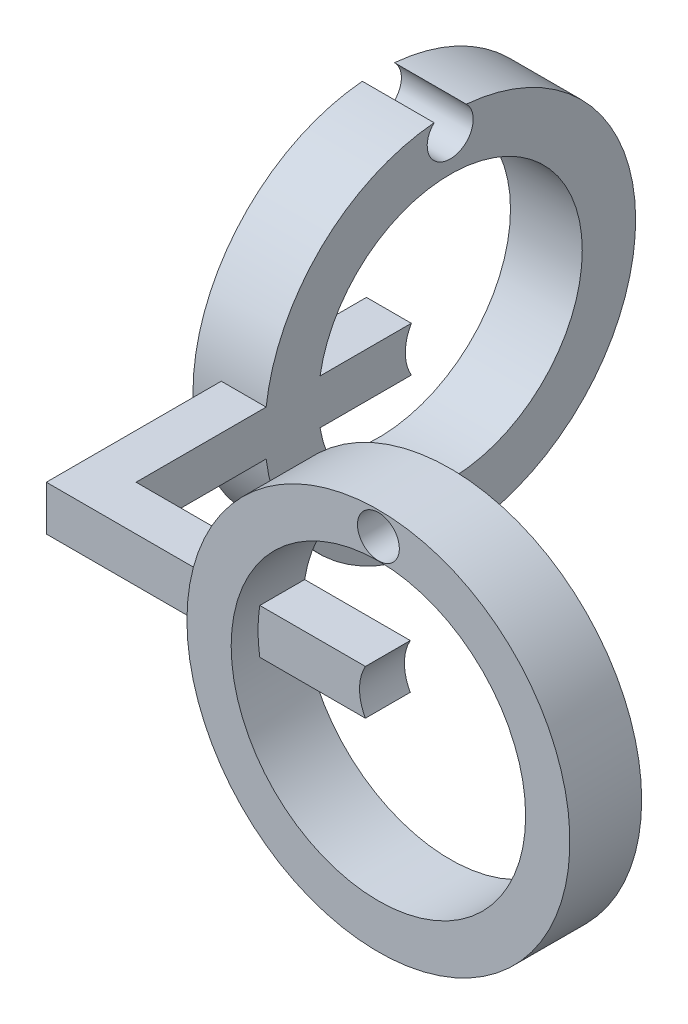
ISO-10303-21;
HEADER;
FILE_DESCRIPTION(('STEP AP214'),'2;1');
FILE_NAME('part.step','',(''),(''),'','','');
FILE_SCHEMA(('AUTOMOTIVE_DESIGN { 1 0 10303 214 1 1 1 1 }'));
ENDSEC;
DATA;
#1=APPLICATION_CONTEXT('core data for automotive mechanical design processes');
#2=APPLICATION_PROTOCOL_DEFINITION('international standard','automotive_design',2000,#1);
#3=PRODUCT_CONTEXT('',#1,'mechanical');
#4=PRODUCT('Part','Part','',(#3));
#5=PRODUCT_RELATED_PRODUCT_CATEGORY('part','',(#4));
#6=PRODUCT_DEFINITION_FORMATION('','',#4);
#7=PRODUCT_DEFINITION_CONTEXT('part definition',#1,'design');
#8=PRODUCT_DEFINITION('design','',#6,#7);
#9=PRODUCT_DEFINITION_SHAPE('','',#8);
#10=(LENGTH_UNIT() NAMED_UNIT(*) SI_UNIT(.MILLI.,.METRE.));
#11=(NAMED_UNIT(*) PLANE_ANGLE_UNIT() SI_UNIT($,.RADIAN.));
#12=(NAMED_UNIT(*) SI_UNIT($,.STERADIAN.) SOLID_ANGLE_UNIT());
#13=UNCERTAINTY_MEASURE_WITH_UNIT(LENGTH_MEASURE(1.E-05),#10,'distance_accuracy_value','');
#14=(GEOMETRIC_REPRESENTATION_CONTEXT(3) GLOBAL_UNCERTAINTY_ASSIGNED_CONTEXT((#13)) GLOBAL_UNIT_ASSIGNED_CONTEXT((#10,
#11,#12)) REPRESENTATION_CONTEXT('',''));
#15=CARTESIAN_POINT('',(0.,0.,0.));
#16=DIRECTION('',(0.,0.,1.));
#17=DIRECTION('',(1.,0.,0.));
#18=AXIS2_PLACEMENT_3D('',#15,#16,#17);
#19=CARTESIAN_POINT('',(-10.,10.,-70.));
#20=DIRECTION('',(1.,0.,0.));
#21=DIRECTION('',(0.,0.,-1.));
#22=AXIS2_PLACEMENT_3D('',#19,#20,#21);
#23=PLANE('',#22);
#24=DIRECTION('',(0.,0.,-1.));
#25=VECTOR('',#24,1.);
#26=CARTESIAN_POINT('',(-10.,3.,-54.6363259094352));
#27=LINE('',#26,#25);
#28=CARTESIAN_POINT('',(-10.,3.,-45.2893319728881));
#29=VERTEX_POINT('',#28);
#30=CARTESIAN_POINT('',(-10.,3.,-47.126509820731));
#31=VERTEX_POINT('',#30);
#32=EDGE_CURVE('E245',#29,#31,#27,.T.);
#33=ORIENTED_EDGE('',*,*,#32,.T.);
#34=CARTESIAN_POINT('',(-10.,5.,-44.3546325792334));
#35=DIRECTION('',(1.,0.,0.));
#36=DIRECTION('',(0.,0.,-1.));
#37=AXIS2_PLACEMENT_3D('',#34,#35,#36);
#38=CIRCLE('',#37,3.41808476225098);
#39=CARTESIAN_POINT('',(-10.,2.,-45.992711772048));
#40=VERTEX_POINT('',#39);
#41=EDGE_CURVE('E299',#40,#31,#38,.F.);
#42=ORIENTED_EDGE('',*,*,#41,.F.);
#43=DIRECTION('',(0.,0.,1.));
#44=VECTOR('',#43,1.);
#45=CARTESIAN_POINT('',(-10.,2.,-54.6363259094352));
#46=LINE('',#45,#44);
#47=CARTESIAN_POINT('',(-10.,2.,-45.2893319728881));
#48=VERTEX_POINT('',#47);
#49=EDGE_CURVE('E239',#40,#48,#46,.T.);
#50=ORIENTED_EDGE('',*,*,#49,.T.);
#51=DIRECTION('',(0.,1.,0.));
#52=VECTOR('',#51,1.);
#53=CARTESIAN_POINT('',(-10.,3.,-45.2893319728881));
#54=LINE('',#53,#52);
#55=EDGE_CURVE('E241',#48,#29,#54,.T.);
#56=ORIENTED_EDGE('',*,*,#55,.T.);
#57=EDGE_LOOP('',(#33,#42,#50,#56));
#58=FACE_BOUND('',#57,.T.);
#59=DIRECTION('',(0.,0.,1.));
#60=VECTOR('',#59,1.);
#61=CARTESIAN_POINT('',(-10.,10.,-70.));
#62=LINE('',#61,#60);
#63=CARTESIAN_POINT('',(-10.,10.,-61.337317676491));
#64=VERTEX_POINT('',#63);
#65=CARTESIAN_POINT('',(-10.,10.,-40.9960456173488));
#66=VERTEX_POINT('',#65);
#67=EDGE_CURVE('E274',#64,#66,#62,.T.);
#68=ORIENTED_EDGE('',*,*,#67,.F.);
#69=CARTESIAN_POINT('',(-10.,5.,-70.));
#70=DIRECTION('',(1.,0.,0.));
#71=DIRECTION('',(0.,0.,-1.));
#72=AXIS2_PLACEMENT_3D('',#69,#70,#71);
#73=CIRCLE('',#72,10.0021030307649);
#74=CARTESIAN_POINT('',(-10.,0.,-61.337317676491));
#75=VERTEX_POINT('',#74);
#76=EDGE_CURVE('E326',#64,#75,#73,.T.);
#77=ORIENTED_EDGE('',*,*,#76,.T.);
#78=DIRECTION('',(0.,0.,1.));
#79=VECTOR('',#78,1.);
#80=CARTESIAN_POINT('',(-10.,0.,-70.));
#81=LINE('',#80,#79);
#82=CARTESIAN_POINT('',(-10.,0.,-40.9960456173488));
#83=VERTEX_POINT('',#82);
#84=EDGE_CURVE('E288',#75,#83,#81,.T.);
#85=ORIENTED_EDGE('',*,*,#84,.T.);
#86=CARTESIAN_POINT('',(-10.,5.,-70.));
#87=DIRECTION('',(1.,0.,0.));
#88=DIRECTION('',(0.,0.,-1.));
#89=AXIS2_PLACEMENT_3D('',#86,#87,#88);
#90=CIRCLE('',#89,29.4317748331784);
#91=EDGE_CURVE('E185',#66,#83,#90,.T.);
#92=ORIENTED_EDGE('',*,*,#91,.F.);
#93=EDGE_LOOP('',(#68,#77,#85,#92));
#94=FACE_BOUND('',#93,.T.);
#95=ADVANCED_FACE('F34',(#58,#94),#23,.F.);
#96=CARTESIAN_POINT('',(0.,10.,0.));
#97=DIRECTION('',(0.,-1.,0.));
#98=DIRECTION('',(0.,0.,-1.));
#99=AXIS2_PLACEMENT_3D('',#96,#97,#98);
#100=PLANE('',#99);
#101=DIRECTION('',(0.,0.,-1.));
#102=VECTOR('',#101,1.);
#103=CARTESIAN_POINT('',(0.,10.,0.));
#104=LINE('',#103,#102);
#105=CARTESIAN_POINT('',(0.,10.,-40.9960456173488));
#106=VERTEX_POINT('',#105);
#107=CARTESIAN_POINT('',(0.,10.,-61.337317676491));
#108=VERTEX_POINT('',#107);
#109=EDGE_CURVE('E268',#106,#108,#104,.T.);
#110=ORIENTED_EDGE('',*,*,#109,.T.);
#111=DIRECTION('',(1.,0.,0.));
#112=VECTOR('',#111,1.);
#113=CARTESIAN_POINT('',(-16.,10.,-61.337317676491));
#114=LINE('',#113,#112);
#115=EDGE_CURVE('E57',#108,#64,#114,.F.);
#116=ORIENTED_EDGE('',*,*,#115,.T.);
#117=ORIENTED_EDGE('',*,*,#67,.T.);
#118=DIRECTION('',(1.,0.,0.));
#119=VECTOR('',#118,1.);
#120=CARTESIAN_POINT('',(-16.,10.,-40.9960456173488));
#121=LINE('',#120,#119);
#122=EDGE_CURVE('E189',#106,#66,#121,.F.);
#123=ORIENTED_EDGE('',*,*,#122,.F.);
#124=EDGE_LOOP('',(#110,#116,#117,#123));
#125=FACE_BOUND('',#124,.T.);
#126=ADVANCED_FACE('F392',(#125),#100,.F.);
#127=CARTESIAN_POINT('',(0.,0.,0.));
#128=DIRECTION('',(0.,-1.,0.));
#129=DIRECTION('',(0.,0.,-1.));
#130=AXIS2_PLACEMENT_3D('',#127,#128,#129);
#131=PLANE('',#130);
#132=DIRECTION('',(1.,0.,0.));
#133=VECTOR('',#132,1.);
#134=CARTESIAN_POINT('',(-16.,0.,-61.337317676491));
#135=LINE('',#134,#133);
#136=CARTESIAN_POINT('',(0.,0.,-61.337317676491));
#137=VERTEX_POINT('',#136);
#138=EDGE_CURVE('E331',#137,#75,#135,.F.);
#139=ORIENTED_EDGE('',*,*,#138,.F.);
#140=DIRECTION('',(0.,0.,-1.));
#141=VECTOR('',#140,1.);
#142=CARTESIAN_POINT('',(0.,0.,0.));
#143=LINE('',#142,#141);
#144=CARTESIAN_POINT('',(0.,0.,-40.9960456173488));
#145=VERTEX_POINT('',#144);
#146=EDGE_CURVE('E283',#145,#137,#143,.T.);
#147=ORIENTED_EDGE('',*,*,#146,.F.);
#148=DIRECTION('',(1.,0.,0.));
#149=VECTOR('',#148,1.);
#150=CARTESIAN_POINT('',(-16.,0.,-40.9960456173488));
#151=LINE('',#150,#149);
#152=EDGE_CURVE('E42',#145,#83,#151,.F.);
#153=ORIENTED_EDGE('',*,*,#152,.T.);
#154=ORIENTED_EDGE('',*,*,#84,.F.);
#155=EDGE_LOOP('',(#139,#147,#153,#154));
#156=FACE_BOUND('',#155,.T.);
#157=ADVANCED_FACE('F313',(#156),#131,.T.);
#158=CARTESIAN_POINT('',(-9.99999999999999,10.,10.));
#159=DIRECTION('',(0.,0.,-1.));
#160=DIRECTION('',(-1.,0.,0.));
#161=AXIS2_PLACEMENT_3D('',#158,#159,#160);
#162=PLANE('',#161);
#163=DIRECTION('',(1.,0.,0.));
#164=VECTOR('',#163,1.);
#165=CARTESIAN_POINT('',(-9.99999999999999,0.,10.));
#166=LINE('',#165,#164);
#167=CARTESIAN_POINT('',(37.571107158068,0.,10.));
#168=VERTEX_POINT('',#167);
#169=CARTESIAN_POINT('',(61.1046655240879,0.,10.));
#170=VERTEX_POINT('',#169);
#171=EDGE_CURVE('E290',#168,#170,#166,.T.);
#172=ORIENTED_EDGE('',*,*,#171,.T.);
#173=CARTESIAN_POINT('',(70.,5.,10.));
#174=DIRECTION('',(0.,0.,-1.));
#175=DIRECTION('',(-1.,0.,0.));
#176=AXIS2_PLACEMENT_3D('',#173,#174,#175);
#177=CIRCLE('',#176,10.2042626112008);
#178=CARTESIAN_POINT('',(61.1046655240879,10.,10.));
#179=VERTEX_POINT('',#178);
#180=EDGE_CURVE('E209',#170,#179,#177,.T.);
#181=ORIENTED_EDGE('',*,*,#180,.T.);
#182=DIRECTION('',(1.,0.,0.));
#183=VECTOR('',#182,1.);
#184=CARTESIAN_POINT('',(-9.99999999999999,10.,10.));
#185=LINE('',#184,#183);
#186=CARTESIAN_POINT('',(37.571107158068,10.,10.));
#187=VERTEX_POINT('',#186);
#188=EDGE_CURVE('E276',#187,#179,#185,.T.);
#189=ORIENTED_EDGE('',*,*,#188,.F.);
#190=CARTESIAN_POINT('',(70.,5.,10.));
#191=DIRECTION('',(0.,0.,-1.));
#192=DIRECTION('',(-1.,0.,0.));
#193=AXIS2_PLACEMENT_3D('',#190,#191,#192);
#194=CIRCLE('',#193,32.8120875738425);
#195=EDGE_CURVE('E225',#168,#187,#194,.T.);
#196=ORIENTED_EDGE('',*,*,#195,.F.);
#197=EDGE_LOOP('',(#172,#181,#189,#196));
#198=FACE_BOUND('',#197,.T.);
#199=ADVANCED_FACE('F376',(#198),#162,.F.);
#200=ORIENTED_EDGE('',*,*,#188,.T.);
#201=DIRECTION('',(0.,0.,-1.));
#202=VECTOR('',#201,1.);
#203=CARTESIAN_POINT('',(61.1046655240879,10.,16.));
#204=LINE('',#203,#202);
#205=CARTESIAN_POINT('',(61.1046655240879,10.,0.));
#206=VERTEX_POINT('',#205);
#207=EDGE_CURVE('E212',#179,#206,#204,.T.);
#208=ORIENTED_EDGE('',*,*,#207,.T.);
#209=DIRECTION('',(-1.,0.,0.));
#210=VECTOR('',#209,1.);
#211=CARTESIAN_POINT('',(70.,10.,0.));
#212=LINE('',#211,#210);
#213=CARTESIAN_POINT('',(37.571107158068,10.,0.));
#214=VERTEX_POINT('',#213);
#215=EDGE_CURVE('E266',#206,#214,#212,.T.);
#216=ORIENTED_EDGE('',*,*,#215,.T.);
#217=DIRECTION('',(0.,0.,-1.));
#218=VECTOR('',#217,1.);
#219=CARTESIAN_POINT('',(37.571107158068,10.,16.));
#220=LINE('',#219,#218);
#221=EDGE_CURVE('E229',#187,#214,#220,.T.);
#222=ORIENTED_EDGE('',*,*,#221,.F.);
#223=EDGE_LOOP('',(#200,#208,#216,#222));
#224=FACE_BOUND('',#223,.T.);
#225=ADVANCED_FACE('F368',(#224),#100,.F.);
#226=DIRECTION('',(0.,0.,-1.));
#227=VECTOR('',#226,1.);
#228=CARTESIAN_POINT('',(61.1046655240879,0.,16.));
#229=LINE('',#228,#227);
#230=CARTESIAN_POINT('',(61.1046655240879,0.,0.));
#231=VERTEX_POINT('',#230);
#232=EDGE_CURVE('E207',#170,#231,#229,.T.);
#233=ORIENTED_EDGE('',*,*,#232,.F.);
#234=ORIENTED_EDGE('',*,*,#171,.F.);
#235=DIRECTION('',(0.,0.,-1.));
#236=VECTOR('',#235,1.);
#237=CARTESIAN_POINT('',(37.571107158068,0.,16.));
#238=LINE('',#237,#236);
#239=CARTESIAN_POINT('',(37.571107158068,0.,0.));
#240=VERTEX_POINT('',#239);
#241=EDGE_CURVE('E304',#168,#240,#238,.T.);
#242=ORIENTED_EDGE('',*,*,#241,.T.);
#243=DIRECTION('',(-1.,0.,0.));
#244=VECTOR('',#243,1.);
#245=CARTESIAN_POINT('',(70.,0.,0.));
#246=LINE('',#245,#244);
#247=EDGE_CURVE('E281',#231,#240,#246,.T.);
#248=ORIENTED_EDGE('',*,*,#247,.F.);
#249=EDGE_LOOP('',(#233,#234,#242,#248));
#250=FACE_BOUND('',#249,.T.);
#251=ADVANCED_FACE('F379',(#250),#131,.T.);
#252=CARTESIAN_POINT('',(-9.99999999999999,0.,10.));
#253=VERTEX_POINT('',#252);
#254=CARTESIAN_POINT('',(27.6258584184119,0.,10.));
#255=VERTEX_POINT('',#254);
#256=EDGE_CURVE('E291',#253,#255,#166,.T.);
#257=ORIENTED_EDGE('',*,*,#256,.T.);
#258=CARTESIAN_POINT('',(70.,5.,10.));
#259=DIRECTION('',(0.,0.,-1.));
#260=DIRECTION('',(-1.,0.,0.));
#261=AXIS2_PLACEMENT_3D('',#258,#259,#260);
#262=CIRCLE('',#261,42.6681130913528);
#263=CARTESIAN_POINT('',(27.6258584184119,10.,10.));
#264=VERTEX_POINT('',#263);
#265=EDGE_CURVE('E232',#255,#264,#262,.T.);
#266=ORIENTED_EDGE('',*,*,#265,.T.);
#267=CARTESIAN_POINT('',(-9.99999999999999,10.,10.));
#268=VERTEX_POINT('',#267);
#269=EDGE_CURVE('E277',#268,#264,#185,.T.);
#270=ORIENTED_EDGE('',*,*,#269,.F.);
#271=DIRECTION('',(0.,-1.,0.));
#272=VECTOR('',#271,1.);
#273=CARTESIAN_POINT('',(-9.99999999999999,10.,10.));
#274=LINE('',#273,#272);
#275=EDGE_CURVE('E280',#268,#253,#274,.T.);
#276=ORIENTED_EDGE('',*,*,#275,.T.);
#277=EDGE_LOOP('',(#257,#266,#270,#276));
#278=FACE_BOUND('',#277,.T.);
#279=ADVANCED_FACE('F357',(#278),#162,.F.);
#280=CARTESIAN_POINT('',(70.,10.,0.));
#281=DIRECTION('',(0.,0.,1.));
#282=DIRECTION('',(1.,0.,0.));
#283=AXIS2_PLACEMENT_3D('',#280,#281,#282);
#284=PLANE('',#283);
#285=CARTESIAN_POINT('',(70.,42.5,0.));
#286=DIRECTION('',(0.,0.,-1.));
#287=DIRECTION('',(-1.,0.,0.));
#288=AXIS2_PLACEMENT_3D('',#285,#286,#287);
#289=CIRCLE('',#288,4.6620797989381);
#290=CARTESIAN_POINT('',(65.3379202010619,42.5,0.));
#291=VERTEX_POINT('',#290);
#292=EDGE_CURVE('E340',#291,#291,#289,.T.);
#293=ORIENTED_EDGE('',*,*,#292,.F.);
#294=EDGE_LOOP('',(#293));
#295=FACE_BOUND('',#294,.T.);
#296=CARTESIAN_POINT('',(27.6258584184119,10.,0.));
#297=VERTEX_POINT('',#296);
#298=CARTESIAN_POINT('',(0.,10.,0.));
#299=VERTEX_POINT('',#298);
#300=EDGE_CURVE('E269',#297,#299,#212,.T.);
#301=ORIENTED_EDGE('',*,*,#300,.F.);
#302=CARTESIAN_POINT('',(70.,5.,0.));
#303=DIRECTION('',(0.,0.,-1.));
#304=DIRECTION('',(-1.,0.,0.));
#305=AXIS2_PLACEMENT_3D('',#302,#303,#304);
#306=CIRCLE('',#305,42.6681130913528);
#307=CARTESIAN_POINT('',(27.6258584184119,0.,0.));
#308=VERTEX_POINT('',#307);
#309=EDGE_CURVE('E219',#297,#308,#306,.T.);
#310=ORIENTED_EDGE('',*,*,#309,.T.);
#311=CARTESIAN_POINT('',(0.,0.,0.));
#312=VERTEX_POINT('',#311);
#313=EDGE_CURVE('E265',#308,#312,#246,.T.);
#314=ORIENTED_EDGE('',*,*,#313,.T.);
#315=DIRECTION('',(0.,-1.,0.));
#316=VECTOR('',#315,1.);
#317=CARTESIAN_POINT('',(0.,10.,0.));
#318=LINE('',#317,#316);
#319=EDGE_CURVE('E296',#299,#312,#318,.T.);
#320=ORIENTED_EDGE('',*,*,#319,.F.);
#321=EDGE_LOOP('',(#301,#310,#314,#320));
#322=FACE_BOUND('',#321,.T.);
#323=ORIENTED_EDGE('',*,*,#215,.F.);
#324=CARTESIAN_POINT('',(70.,5.,0.));
#325=DIRECTION('',(0.,0.,-1.));
#326=DIRECTION('',(-1.,0.,0.));
#327=AXIS2_PLACEMENT_3D('',#324,#325,#326);
#328=CIRCLE('',#327,10.2042626112008);
#329=EDGE_CURVE('E205',#231,#206,#328,.T.);
#330=ORIENTED_EDGE('',*,*,#329,.F.);
#331=ORIENTED_EDGE('',*,*,#247,.T.);
#332=CARTESIAN_POINT('',(70.,5.,0.));
#333=DIRECTION('',(0.,0.,-1.));
#334=DIRECTION('',(-1.,0.,0.));
#335=AXIS2_PLACEMENT_3D('',#332,#333,#334);
#336=CIRCLE('',#335,32.8120875738425);
#337=EDGE_CURVE('E215',#214,#240,#336,.T.);
#338=ORIENTED_EDGE('',*,*,#337,.F.);
#339=EDGE_LOOP('',(#323,#330,#331,#338));
#340=FACE_BOUND('',#339,.T.);
#341=ADVANCED_FACE('F36',(#295,#322,#340),#284,.F.);
#342=CARTESIAN_POINT('',(0.,10.,0.));
#343=DIRECTION('',(-1.,0.,0.));
#344=DIRECTION('',(0.,0.,1.));
#345=AXIS2_PLACEMENT_3D('',#342,#343,#344);
#346=PLANE('',#345);
#347=CARTESIAN_POINT('',(0.,5.,-70.));
#348=DIRECTION('',(1.,0.,0.));
#349=DIRECTION('',(0.,0.,-1.));
#350=AXIS2_PLACEMENT_3D('',#347,#348,#349);
#351=CIRCLE('',#350,41.320841222883);
#352=CARTESIAN_POINT('',(0.,0.,-28.9827850852023));
#353=VERTEX_POINT('',#352);
#354=CARTESIAN_POINT('',(0.,46.1652175720672,-73.5828454629077));
#355=VERTEX_POINT('',#354);
#356=EDGE_CURVE('E186',#353,#355,#351,.T.);
#357=ORIENTED_EDGE('',*,*,#356,.T.);
#358=CARTESIAN_POINT('',(0.,42.5,-70.));
#359=DIRECTION('',(1.,0.,0.));
#360=DIRECTION('',(0.,0.,-1.));
#361=AXIS2_PLACEMENT_3D('',#358,#359,#360);
#362=CIRCLE('',#361,5.12548548546073);
#363=CARTESIAN_POINT('',(0.,46.1652175720672,-66.4171545370923));
#364=VERTEX_POINT('',#363);
#365=EDGE_CURVE('E175',#364,#355,#362,.T.);
#366=ORIENTED_EDGE('',*,*,#365,.F.);
#367=CARTESIAN_POINT('',(0.,10.,-28.9827850852023));
#368=VERTEX_POINT('',#367);
#369=EDGE_CURVE('E182',#364,#368,#351,.T.);
#370=ORIENTED_EDGE('',*,*,#369,.T.);
#371=EDGE_CURVE('E270',#299,#368,#104,.T.);
#372=ORIENTED_EDGE('',*,*,#371,.F.);
#373=ORIENTED_EDGE('',*,*,#319,.T.);
#374=EDGE_CURVE('E284',#312,#353,#143,.T.);
#375=ORIENTED_EDGE('',*,*,#374,.T.);
#376=EDGE_LOOP('',(#357,#366,#370,#372,#373,#375));
#377=FACE_BOUND('',#376,.T.);
#378=ORIENTED_EDGE('',*,*,#146,.T.);
#379=CARTESIAN_POINT('',(0.,5.,-70.));
#380=DIRECTION('',(1.,0.,0.));
#381=DIRECTION('',(0.,0.,-1.));
#382=AXIS2_PLACEMENT_3D('',#379,#380,#381);
#383=CIRCLE('',#382,10.0021030307649);
#384=EDGE_CURVE('E335',#108,#137,#383,.T.);
#385=ORIENTED_EDGE('',*,*,#384,.F.);
#386=ORIENTED_EDGE('',*,*,#109,.F.);
#387=CARTESIAN_POINT('',(0.,5.,-70.));
#388=DIRECTION('',(1.,0.,0.));
#389=DIRECTION('',(0.,0.,-1.));
#390=AXIS2_PLACEMENT_3D('',#387,#388,#389);
#391=CIRCLE('',#390,29.4317748331784);
#392=EDGE_CURVE('E194',#145,#106,#391,.T.);
#393=ORIENTED_EDGE('',*,*,#392,.F.);
#394=EDGE_LOOP('',(#378,#385,#386,#393));
#395=FACE_BOUND('',#394,.T.);
#396=ADVANCED_FACE('F322',(#377,#395),#346,.F.);
#397=CARTESIAN_POINT('',(-10.,10.,-28.9827850852023));
#398=VERTEX_POINT('',#397);
#399=EDGE_CURVE('E273',#398,#268,#62,.T.);
#400=ORIENTED_EDGE('',*,*,#399,.F.);
#401=CARTESIAN_POINT('',(-10.,5.,-70.));
#402=DIRECTION('',(1.,0.,0.));
#403=DIRECTION('',(0.,0.,-1.));
#404=AXIS2_PLACEMENT_3D('',#401,#402,#403);
#405=CIRCLE('',#404,41.320841222883);
#406=CARTESIAN_POINT('',(-10.,0.,-28.9827850852023));
#407=VERTEX_POINT('',#406);
#408=EDGE_CURVE('E199',#398,#407,#405,.T.);
#409=ORIENTED_EDGE('',*,*,#408,.T.);
#410=EDGE_CURVE('E287',#407,#253,#81,.T.);
#411=ORIENTED_EDGE('',*,*,#410,.T.);
#412=ORIENTED_EDGE('',*,*,#275,.F.);
#413=EDGE_LOOP('',(#400,#409,#411,#412));
#414=FACE_BOUND('',#413,.T.);
#415=ADVANCED_FACE('F395',(#414),#23,.F.);
#416=ORIENTED_EDGE('',*,*,#371,.T.);
#417=DIRECTION('',(1.,0.,0.));
#418=VECTOR('',#417,1.);
#419=CARTESIAN_POINT('',(-16.,10.,-28.9827850852023));
#420=LINE('',#419,#418);
#421=EDGE_CURVE('E202',#368,#398,#420,.F.);
#422=ORIENTED_EDGE('',*,*,#421,.T.);
#423=ORIENTED_EDGE('',*,*,#399,.T.);
#424=ORIENTED_EDGE('',*,*,#269,.T.);
#425=DIRECTION('',(0.,0.,-1.));
#426=VECTOR('',#425,1.);
#427=CARTESIAN_POINT('',(27.6258584184119,10.,16.));
#428=LINE('',#427,#426);
#429=EDGE_CURVE('E235',#264,#297,#428,.T.);
#430=ORIENTED_EDGE('',*,*,#429,.T.);
#431=ORIENTED_EDGE('',*,*,#300,.T.);
#432=EDGE_LOOP('',(#416,#422,#423,#424,#430,#431));
#433=FACE_BOUND('',#432,.T.);
#434=ADVANCED_FACE('F400',(#433),#100,.F.);
#435=DIRECTION('',(1.,0.,0.));
#436=VECTOR('',#435,1.);
#437=CARTESIAN_POINT('',(-16.,0.,-28.9827850852023));
#438=LINE('',#437,#436);
#439=EDGE_CURVE('E11',#353,#407,#438,.F.);
#440=ORIENTED_EDGE('',*,*,#439,.F.);
#441=ORIENTED_EDGE('',*,*,#374,.F.);
#442=ORIENTED_EDGE('',*,*,#313,.F.);
#443=DIRECTION('',(0.,0.,-1.));
#444=VECTOR('',#443,1.);
#445=CARTESIAN_POINT('',(27.6258584184119,0.,16.));
#446=LINE('',#445,#444);
#447=EDGE_CURVE('E307',#255,#308,#446,.T.);
#448=ORIENTED_EDGE('',*,*,#447,.F.);
#449=ORIENTED_EDGE('',*,*,#256,.F.);
#450=ORIENTED_EDGE('',*,*,#410,.F.);
#451=EDGE_LOOP('',(#440,#441,#442,#448,#449,#450));
#452=FACE_BOUND('',#451,.T.);
#453=ADVANCED_FACE('F409',(#452),#131,.T.);
#454=CARTESIAN_POINT('',(-15.,5.,-44.3546325792334));
#455=DIRECTION('',(1.,0.,0.));
#456=DIRECTION('',(0.,0.,-1.));
#457=AXIS2_PLACEMENT_3D('',#454,#455,#456);
#458=CYLINDRICAL_SURFACE('',#457,3.41808476225098);
#459=ORIENTED_EDGE('',*,*,#41,.T.);
#460=DIRECTION('',(1.,0.,0.));
#461=VECTOR('',#460,1.);
#462=CARTESIAN_POINT('',(-15.,3.,-47.126509820731));
#463=LINE('',#462,#461);
#464=CARTESIAN_POINT('',(-15.,3.,-47.126509820731));
#465=VERTEX_POINT('',#464);
#466=EDGE_CURVE('E259',#31,#465,#463,.F.);
#467=ORIENTED_EDGE('',*,*,#466,.T.);
#468=CARTESIAN_POINT('',(-15.,5.,-44.3546325792334));
#469=DIRECTION('',(-1.,0.,0.));
#470=DIRECTION('',(0.,0.,1.));
#471=AXIS2_PLACEMENT_3D('',#468,#469,#470);
#472=CIRCLE('',#471,3.41808476225098);
#473=CARTESIAN_POINT('',(-15.,2.,-45.992711772048));
#474=VERTEX_POINT('',#473);
#475=EDGE_CURVE('E262',#474,#465,#472,.T.);
#476=ORIENTED_EDGE('',*,*,#475,.F.);
#477=DIRECTION('',(1.,0.,0.));
#478=VECTOR('',#477,1.);
#479=CARTESIAN_POINT('',(-15.,2.,-45.992711772048));
#480=LINE('',#479,#478);
#481=EDGE_CURVE('E254',#474,#40,#480,.T.);
#482=ORIENTED_EDGE('',*,*,#481,.T.);
#483=EDGE_LOOP('',(#459,#467,#476,#482));
#484=FACE_BOUND('',#483,.T.);
#485=ADVANCED_FACE('F449',(#484),#458,.T.);
#486=CARTESIAN_POINT('',(-15.,5.,-44.3546325792334));
#487=DIRECTION('',(-1.,0.,0.));
#488=DIRECTION('',(0.,0.,1.));
#489=AXIS2_PLACEMENT_3D('',#486,#487,#488);
#490=PLANE('',#489);
#491=DIRECTION('',(0.,0.,-1.));
#492=VECTOR('',#491,1.);
#493=CARTESIAN_POINT('',(-15.,3.,-54.6363259094352));
#494=LINE('',#493,#492);
#495=CARTESIAN_POINT('',(-15.,3.,-45.2893319728881));
#496=VERTEX_POINT('',#495);
#497=EDGE_CURVE('E242',#496,#465,#494,.T.);
#498=ORIENTED_EDGE('',*,*,#497,.F.);
#499=DIRECTION('',(0.,1.,0.));
#500=VECTOR('',#499,1.);
#501=CARTESIAN_POINT('',(-15.,3.,-45.2893319728881));
#502=LINE('',#501,#500);
#503=CARTESIAN_POINT('',(-15.,2.,-45.2893319728881));
#504=VERTEX_POINT('',#503);
#505=EDGE_CURVE('E238',#504,#496,#502,.T.);
#506=ORIENTED_EDGE('',*,*,#505,.F.);
#507=DIRECTION('',(0.,0.,1.));
#508=VECTOR('',#507,1.);
#509=CARTESIAN_POINT('',(-15.,2.,-44.3546325792334));
#510=LINE('',#509,#508);
#511=EDGE_CURVE('E302',#474,#504,#510,.T.);
#512=ORIENTED_EDGE('',*,*,#511,.F.);
#513=ORIENTED_EDGE('',*,*,#475,.T.);
#514=EDGE_LOOP('',(#498,#506,#512,#513));
#515=FACE_BOUND('',#514,.T.);
#516=ADVANCED_FACE('F441',(#515),#490,.T.);
#517=CARTESIAN_POINT('',(-10.,3.,-54.6363259094352));
#518=DIRECTION('',(0.,1.,0.));
#519=DIRECTION('',(0.,0.,1.));
#520=AXIS2_PLACEMENT_3D('',#517,#518,#519);
#521=PLANE('',#520);
#522=ORIENTED_EDGE('',*,*,#32,.F.);
#523=DIRECTION('',(-1.,0.,0.));
#524=VECTOR('',#523,1.);
#525=CARTESIAN_POINT('',(-10.,3.,-45.2893319728881));
#526=LINE('',#525,#524);
#527=EDGE_CURVE('E252',#29,#496,#526,.T.);
#528=ORIENTED_EDGE('',*,*,#527,.T.);
#529=ORIENTED_EDGE('',*,*,#497,.T.);
#530=ORIENTED_EDGE('',*,*,#466,.F.);
#531=EDGE_LOOP('',(#522,#528,#529,#530));
#532=FACE_BOUND('',#531,.T.);
#533=ADVANCED_FACE('F439',(#532),#521,.F.);
#534=CARTESIAN_POINT('',(-10.,2.,-54.6363259094352));
#535=DIRECTION('',(0.,-1.,0.));
#536=DIRECTION('',(0.,0.,-1.));
#537=AXIS2_PLACEMENT_3D('',#534,#535,#536);
#538=PLANE('',#537);
#539=ORIENTED_EDGE('',*,*,#511,.T.);
#540=DIRECTION('',(-1.,0.,0.));
#541=VECTOR('',#540,1.);
#542=CARTESIAN_POINT('',(-10.,2.,-45.2893319728881));
#543=LINE('',#542,#541);
#544=EDGE_CURVE('E248',#48,#504,#543,.T.);
#545=ORIENTED_EDGE('',*,*,#544,.F.);
#546=ORIENTED_EDGE('',*,*,#49,.F.);
#547=ORIENTED_EDGE('',*,*,#481,.F.);
#548=EDGE_LOOP('',(#539,#545,#546,#547));
#549=FACE_BOUND('',#548,.T.);
#550=ADVANCED_FACE('F435',(#549),#538,.F.);
#551=CARTESIAN_POINT('',(-10.,3.,-45.2893319728881));
#552=DIRECTION('',(0.,0.,1.));
#553=DIRECTION('',(1.,0.,0.));
#554=AXIS2_PLACEMENT_3D('',#551,#552,#553);
#555=PLANE('',#554);
#556=ORIENTED_EDGE('',*,*,#505,.T.);
#557=ORIENTED_EDGE('',*,*,#527,.F.);
#558=ORIENTED_EDGE('',*,*,#55,.F.);
#559=ORIENTED_EDGE('',*,*,#544,.T.);
#560=EDGE_LOOP('',(#556,#557,#558,#559));
#561=FACE_BOUND('',#560,.T.);
#562=ADVANCED_FACE('F427',(#561),#555,.F.);
#563=CARTESIAN_POINT('',(70.,5.,16.));
#564=DIRECTION('',(0.,0.,-1.));
#565=DIRECTION('',(-1.,0.,0.));
#566=AXIS2_PLACEMENT_3D('',#563,#564,#565);
#567=CYLINDRICAL_SURFACE('',#566,42.6681130913528);
#568=CARTESIAN_POINT('',(70.,5.,16.));
#569=DIRECTION('',(0.,0.,-1.));
#570=DIRECTION('',(-1.,0.,0.));
#571=AXIS2_PLACEMENT_3D('',#568,#569,#570);
#572=CIRCLE('',#571,42.6681130913528);
#573=CARTESIAN_POINT('',(27.3318869086472,5.,16.));
#574=VERTEX_POINT('',#573);
#575=EDGE_CURVE('E222',#574,#574,#572,.T.);
#576=ORIENTED_EDGE('',*,*,#575,.T.);
#577=EDGE_LOOP('',(#576));
#578=FACE_BOUND('',#577,.T.);
#579=ORIENTED_EDGE('',*,*,#429,.F.);
#580=ORIENTED_EDGE('',*,*,#265,.F.);
#581=ORIENTED_EDGE('',*,*,#447,.T.);
#582=ORIENTED_EDGE('',*,*,#309,.F.);
#583=EDGE_LOOP('',(#579,#580,#581,#582));
#584=FACE_BOUND('',#583,.T.);
#585=ADVANCED_FACE('F425',(#578,#584),#567,.T.);
#586=CARTESIAN_POINT('',(70.,5.,16.));
#587=DIRECTION('',(0.,0.,-1.));
#588=DIRECTION('',(-1.,0.,0.));
#589=AXIS2_PLACEMENT_3D('',#586,#587,#588);
#590=CYLINDRICAL_SURFACE('',#589,32.8120875738425);
#591=CARTESIAN_POINT('',(70.,5.,16.));
#592=DIRECTION('',(0.,0.,-1.));
#593=DIRECTION('',(-1.,0.,0.));
#594=AXIS2_PLACEMENT_3D('',#591,#592,#593);
#595=CIRCLE('',#594,32.8120875738425);
#596=CARTESIAN_POINT('',(37.1879124261575,5.,16.));
#597=VERTEX_POINT('',#596);
#598=EDGE_CURVE('E216',#597,#597,#595,.T.);
#599=ORIENTED_EDGE('',*,*,#598,.F.);
#600=EDGE_LOOP('',(#599));
#601=FACE_BOUND('',#600,.T.);
#602=ORIENTED_EDGE('',*,*,#195,.T.);
#603=ORIENTED_EDGE('',*,*,#221,.T.);
#604=ORIENTED_EDGE('',*,*,#337,.T.);
#605=ORIENTED_EDGE('',*,*,#241,.F.);
#606=EDGE_LOOP('',(#602,#603,#604,#605));
#607=FACE_BOUND('',#606,.T.);
#608=ADVANCED_FACE('F371',(#601,#607),#590,.F.);
#609=CARTESIAN_POINT('',(70.,5.,16.));
#610=DIRECTION('',(0.,0.,-1.));
#611=DIRECTION('',(-1.,0.,0.));
#612=AXIS2_PLACEMENT_3D('',#609,#610,#611);
#613=PLANE('',#612);
#614=CARTESIAN_POINT('',(70.,42.5,16.));
#615=DIRECTION('',(0.,0.,-1.));
#616=DIRECTION('',(-1.,0.,0.));
#617=AXIS2_PLACEMENT_3D('',#614,#615,#616);
#618=CIRCLE('',#617,4.6620797989381);
#619=CARTESIAN_POINT('',(65.3379202010619,42.5,16.));
#620=VERTEX_POINT('',#619);
#621=EDGE_CURVE('E338',#620,#620,#618,.T.);
#622=ORIENTED_EDGE('',*,*,#621,.T.);
#623=EDGE_LOOP('',(#622));
#624=FACE_BOUND('',#623,.T.);
#625=ORIENTED_EDGE('',*,*,#598,.T.);
#626=EDGE_LOOP('',(#625));
#627=FACE_BOUND('',#626,.T.);
#628=ORIENTED_EDGE('',*,*,#575,.F.);
#629=EDGE_LOOP('',(#628));
#630=FACE_BOUND('',#629,.T.);
#631=ADVANCED_FACE('F346',(#624,#627,#630),#613,.F.);
#632=CARTESIAN_POINT('',(70.,5.,16.));
#633=DIRECTION('',(0.,0.,-1.));
#634=DIRECTION('',(-1.,0.,0.));
#635=AXIS2_PLACEMENT_3D('',#632,#633,#634);
#636=CYLINDRICAL_SURFACE('',#635,10.2042626112008);
#637=ORIENTED_EDGE('',*,*,#180,.F.);
#638=ORIENTED_EDGE('',*,*,#232,.T.);
#639=ORIENTED_EDGE('',*,*,#329,.T.);
#640=ORIENTED_EDGE('',*,*,#207,.F.);
#641=EDGE_LOOP('',(#637,#638,#639,#640));
#642=FACE_BOUND('',#641,.T.);
#643=ADVANCED_FACE('F381',(#642),#636,.F.);
#644=CARTESIAN_POINT('',(-16.,5.,-70.));
#645=DIRECTION('',(1.,0.,0.));
#646=DIRECTION('',(0.,0.,-1.));
#647=AXIS2_PLACEMENT_3D('',#644,#645,#646);
#648=CYLINDRICAL_SURFACE('',#647,41.320841222883);
#649=DIRECTION('',(1.,0.,0.));
#650=VECTOR('',#649,1.);
#651=CARTESIAN_POINT('',(-16.,46.1652175720672,-66.4171545370923));
#652=LINE('',#651,#650);
#653=CARTESIAN_POINT('',(-16.,46.1652175720672,-66.4171545370923));
#654=VERTEX_POINT('',#653);
#655=EDGE_CURVE('E170',#654,#364,#652,.T.);
#656=ORIENTED_EDGE('',*,*,#655,.F.);
#657=CARTESIAN_POINT('',(-16.,5.,-70.));
#658=DIRECTION('',(1.,0.,0.));
#659=DIRECTION('',(0.,0.,-1.));
#660=AXIS2_PLACEMENT_3D('',#657,#658,#659);
#661=CIRCLE('',#660,41.320841222883);
#662=CARTESIAN_POINT('',(-16.,46.1652175720672,-73.5828454629077));
#663=VERTEX_POINT('',#662);
#664=EDGE_CURVE('E180',#654,#663,#661,.T.);
#665=ORIENTED_EDGE('',*,*,#664,.T.);
#666=DIRECTION('',(1.,0.,0.));
#667=VECTOR('',#666,1.);
#668=CARTESIAN_POINT('',(-16.,46.1652175720672,-73.5828454629077));
#669=LINE('',#668,#667);
#670=EDGE_CURVE('E49',#663,#355,#669,.T.);
#671=ORIENTED_EDGE('',*,*,#670,.T.);
#672=ORIENTED_EDGE('',*,*,#356,.F.);
#673=ORIENTED_EDGE('',*,*,#439,.T.);
#674=ORIENTED_EDGE('',*,*,#408,.F.);
#675=ORIENTED_EDGE('',*,*,#421,.F.);
#676=ORIENTED_EDGE('',*,*,#369,.F.);
#677=EDGE_LOOP('',(#656,#665,#671,#672,#673,#674,#675,#676));
#678=FACE_BOUND('',#677,.T.);
#679=ADVANCED_FACE('F179',(#678),#648,.T.);
#680=CARTESIAN_POINT('',(-16.,5.,-70.));
#681=DIRECTION('',(1.,0.,0.));
#682=DIRECTION('',(0.,0.,-1.));
#683=AXIS2_PLACEMENT_3D('',#680,#681,#682);
#684=CYLINDRICAL_SURFACE('',#683,29.4317748331784);
#685=CARTESIAN_POINT('',(-16.,5.,-70.));
#686=DIRECTION('',(1.,0.,0.));
#687=DIRECTION('',(0.,0.,-1.));
#688=AXIS2_PLACEMENT_3D('',#685,#686,#687);
#689=CIRCLE('',#688,29.4317748331784);
#690=CARTESIAN_POINT('',(-16.,5.,-99.4317748331784));
#691=VERTEX_POINT('',#690);
#692=EDGE_CURVE('E324',#691,#691,#689,.T.);
#693=ORIENTED_EDGE('',*,*,#692,.F.);
#694=EDGE_LOOP('',(#693));
#695=FACE_BOUND('',#694,.T.);
#696=ORIENTED_EDGE('',*,*,#392,.T.);
#697=ORIENTED_EDGE('',*,*,#122,.T.);
#698=ORIENTED_EDGE('',*,*,#91,.T.);
#699=ORIENTED_EDGE('',*,*,#152,.F.);
#700=EDGE_LOOP('',(#696,#697,#698,#699));
#701=FACE_BOUND('',#700,.T.);
#702=ADVANCED_FACE('F317',(#695,#701),#684,.F.);
#703=CARTESIAN_POINT('',(-16.,5.,-70.));
#704=DIRECTION('',(1.,0.,0.));
#705=DIRECTION('',(0.,0.,-1.));
#706=AXIS2_PLACEMENT_3D('',#703,#704,#705);
#707=PLANE('',#706);
#708=ORIENTED_EDGE('',*,*,#692,.T.);
#709=EDGE_LOOP('',(#708));
#710=FACE_BOUND('',#709,.T.);
#711=ORIENTED_EDGE('',*,*,#664,.F.);
#712=CARTESIAN_POINT('',(-16.,42.5,-70.));
#713=DIRECTION('',(1.,0.,0.));
#714=DIRECTION('',(0.,0.,-1.));
#715=AXIS2_PLACEMENT_3D('',#712,#713,#714);
#716=CIRCLE('',#715,5.12548548546073);
#717=EDGE_CURVE('E167',#654,#663,#716,.T.);
#718=ORIENTED_EDGE('',*,*,#717,.T.);
#719=EDGE_LOOP('',(#711,#718));
#720=FACE_BOUND('',#719,.T.);
#721=ADVANCED_FACE('F184',(#710,#720),#707,.F.);
#722=CARTESIAN_POINT('',(-16.,5.,-70.));
#723=DIRECTION('',(1.,0.,0.));
#724=DIRECTION('',(0.,0.,-1.));
#725=AXIS2_PLACEMENT_3D('',#722,#723,#724);
#726=CYLINDRICAL_SURFACE('',#725,10.0021030307649);
#727=ORIENTED_EDGE('',*,*,#384,.T.);
#728=ORIENTED_EDGE('',*,*,#138,.T.);
#729=ORIENTED_EDGE('',*,*,#76,.F.);
#730=ORIENTED_EDGE('',*,*,#115,.F.);
#731=EDGE_LOOP('',(#727,#728,#729,#730));
#732=FACE_BOUND('',#731,.T.);
#733=ADVANCED_FACE('F594',(#732),#726,.F.);
#734=CARTESIAN_POINT('',(-16.,42.5,-70.));
#735=DIRECTION('',(1.,0.,0.));
#736=DIRECTION('',(0.,0.,-1.));
#737=AXIS2_PLACEMENT_3D('',#734,#735,#736);
#738=CYLINDRICAL_SURFACE('',#737,5.12548548546073);
#739=ORIENTED_EDGE('',*,*,#365,.T.);
#740=ORIENTED_EDGE('',*,*,#670,.F.);
#741=ORIENTED_EDGE('',*,*,#717,.F.);
#742=ORIENTED_EDGE('',*,*,#655,.T.);
#743=EDGE_LOOP('',(#739,#740,#741,#742));
#744=FACE_BOUND('',#743,.T.);
#745=ADVANCED_FACE('F169',(#744),#738,.F.);
#746=CARTESIAN_POINT('',(70.,42.5,16.));
#747=DIRECTION('',(0.,0.,-1.));
#748=DIRECTION('',(-1.,0.,0.));
#749=AXIS2_PLACEMENT_3D('',#746,#747,#748);
#750=CYLINDRICAL_SURFACE('',#749,4.6620797989381);
#751=ORIENTED_EDGE('',*,*,#621,.F.);
#752=EDGE_LOOP('',(#751));
#753=FACE_BOUND('',#752,.T.);
#754=ORIENTED_EDGE('',*,*,#292,.T.);
#755=EDGE_LOOP('',(#754));
#756=FACE_BOUND('',#755,.T.);
#757=ADVANCED_FACE('F349',(#753,#756),#750,.F.);
#758=CLOSED_SHELL('',(#95,#126,#157,#199,#225,#251,#279,#341,#396,#415,#434,#453,#485,#516,#533,
#550,#562,#585,#608,#631,#643,#679,#702,#721,#733,#745,#757));
#759=MANIFOLD_SOLID_BREP('B2',#758);
#760=ADVANCED_BREP_SHAPE_REPRESENTATION('',(#18,#759),#14);
#761=SHAPE_DEFINITION_REPRESENTATION(#9,#760);
ENDSEC;
END-ISO-10303-21;
